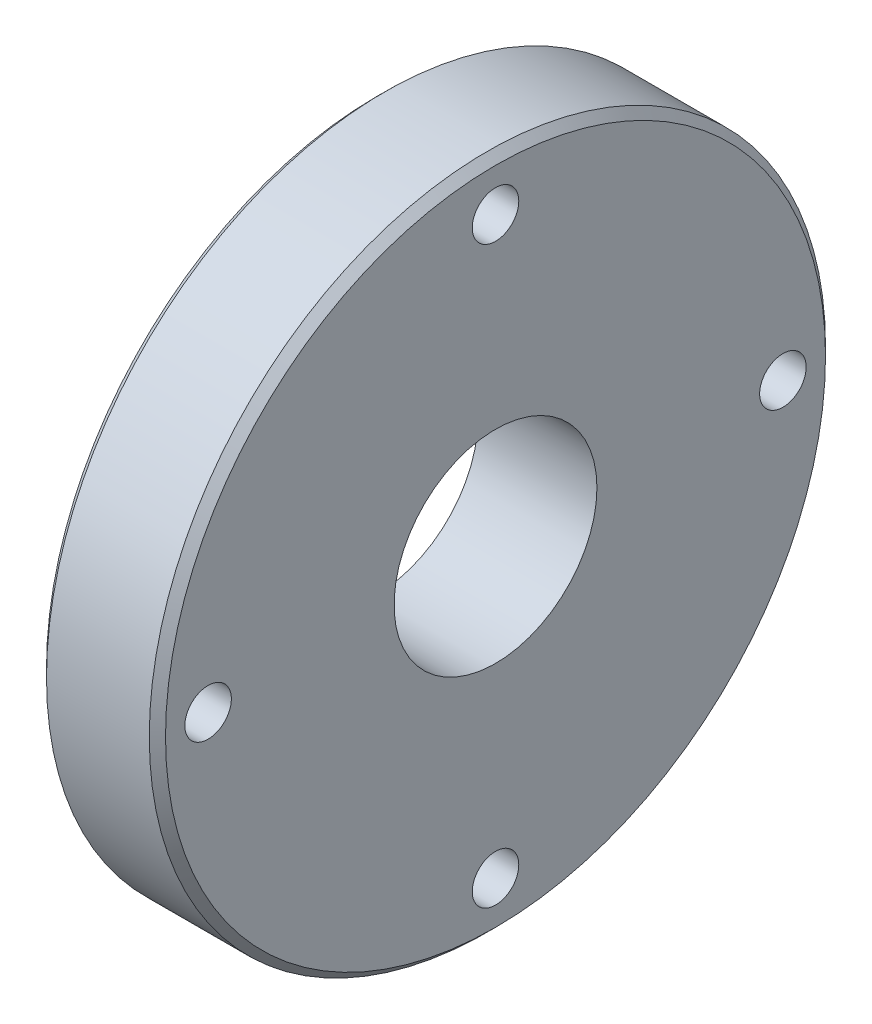
ISO-10303-21;
HEADER;
FILE_DESCRIPTION(('STEP AP214'),'2;1');
FILE_NAME('part.step','',(''),(''),'','','');
FILE_SCHEMA(('AUTOMOTIVE_DESIGN { 1 0 10303 214 1 1 1 1 }'));
ENDSEC;
DATA;
#1=APPLICATION_CONTEXT('core data for automotive mechanical design processes');
#2=APPLICATION_PROTOCOL_DEFINITION('international standard','automotive_design',2000,#1);
#3=PRODUCT_CONTEXT('',#1,'mechanical');
#4=PRODUCT('Part','Part','',(#3));
#5=PRODUCT_RELATED_PRODUCT_CATEGORY('part','',(#4));
#6=PRODUCT_DEFINITION_FORMATION('','',#4);
#7=PRODUCT_DEFINITION_CONTEXT('part definition',#1,'design');
#8=PRODUCT_DEFINITION('design','',#6,#7);
#9=PRODUCT_DEFINITION_SHAPE('','',#8);
#10=(LENGTH_UNIT() NAMED_UNIT(*) SI_UNIT(.MILLI.,.METRE.));
#11=(NAMED_UNIT(*) PLANE_ANGLE_UNIT() SI_UNIT($,.RADIAN.));
#12=(NAMED_UNIT(*) SI_UNIT($,.STERADIAN.) SOLID_ANGLE_UNIT());
#13=UNCERTAINTY_MEASURE_WITH_UNIT(LENGTH_MEASURE(1.E-05),#10,'distance_accuracy_value','');
#14=(GEOMETRIC_REPRESENTATION_CONTEXT(3) GLOBAL_UNCERTAINTY_ASSIGNED_CONTEXT((#13)) GLOBAL_UNIT_ASSIGNED_CONTEXT((#10,
#11,#12)) REPRESENTATION_CONTEXT('',''));
#15=CARTESIAN_POINT('',(0.,0.,0.));
#16=DIRECTION('',(0.,0.,1.));
#17=DIRECTION('',(1.,0.,0.));
#18=AXIS2_PLACEMENT_3D('',#15,#16,#17);
#19=CARTESIAN_POINT('',(22.352,0.,0.));
#20=DIRECTION('',(-1.,0.,0.));
#21=DIRECTION('',(0.,0.,1.));
#22=AXIS2_PLACEMENT_3D('',#19,#20,#21);
#23=CYLINDRICAL_SURFACE('',#22,63.5);
#24=CARTESIAN_POINT('',(20.828,0.,0.));
#25=DIRECTION('',(1.,0.,0.));
#26=DIRECTION('',(0.,0.,-1.));
#27=AXIS2_PLACEMENT_3D('',#24,#25,#26);
#28=CIRCLE('',#27,63.5);
#29=CARTESIAN_POINT('',(20.828,0.,63.5));
#30=VERTEX_POINT('',#29);
#31=EDGE_CURVE('E47',#30,#30,#28,.F.);
#32=ORIENTED_EDGE('',*,*,#31,.T.);
#33=EDGE_LOOP('',(#32));
#34=FACE_BOUND('',#33,.T.);
#35=CARTESIAN_POINT('',(1.52399999999998,0.,0.));
#36=DIRECTION('',(1.,0.,0.));
#37=DIRECTION('',(0.,0.,-1.));
#38=AXIS2_PLACEMENT_3D('',#35,#36,#37);
#39=CIRCLE('',#38,63.5);
#40=CARTESIAN_POINT('',(1.52399999999998,0.,-63.5));
#41=VERTEX_POINT('',#40);
#42=EDGE_CURVE('E51',#41,#41,#39,.T.);
#43=ORIENTED_EDGE('',*,*,#42,.T.);
#44=EDGE_LOOP('',(#43));
#45=FACE_BOUND('',#44,.T.);
#46=ADVANCED_FACE('F39',(#34,#45),#23,.T.);
#47=CARTESIAN_POINT('',(22.352,0.,0.));
#48=DIRECTION('',(1.,0.,0.));
#49=DIRECTION('',(0.,0.,-1.));
#50=AXIS2_PLACEMENT_3D('',#47,#48,#49);
#51=PLANE('',#50);
#52=CARTESIAN_POINT('',(22.352,0.,0.));
#53=DIRECTION('',(1.,0.,0.));
#54=DIRECTION('',(0.,0.,-1.));
#55=AXIS2_PLACEMENT_3D('',#52,#53,#54);
#56=CIRCLE('',#55,61.976);
#57=CARTESIAN_POINT('',(22.352,0.,61.976));
#58=VERTEX_POINT('',#57);
#59=EDGE_CURVE('E55',#58,#58,#56,.T.);
#60=ORIENTED_EDGE('',*,*,#59,.T.);
#61=EDGE_LOOP('',(#60));
#62=FACE_BOUND('',#61,.T.);
#63=CARTESIAN_POINT('',(22.352,53.975,0.));
#64=DIRECTION('',(1.,0.,0.));
#65=DIRECTION('',(0.,0.,-1.));
#66=AXIS2_PLACEMENT_3D('',#63,#64,#65);
#67=CIRCLE('',#66,4.3688);
#68=CARTESIAN_POINT('',(22.352,53.975,-4.3688));
#69=VERTEX_POINT('',#68);
#70=EDGE_CURVE('E78',#69,#69,#67,.T.);
#71=ORIENTED_EDGE('',*,*,#70,.F.);
#72=EDGE_LOOP('',(#71));
#73=FACE_BOUND('',#72,.T.);
#74=CARTESIAN_POINT('',(22.352,0.,53.975));
#75=DIRECTION('',(1.,0.,0.));
#76=DIRECTION('',(0.,0.,-1.));
#77=AXIS2_PLACEMENT_3D('',#74,#75,#76);
#78=CIRCLE('',#77,4.3688);
#79=CARTESIAN_POINT('',(22.352,0.,49.6062));
#80=VERTEX_POINT('',#79);
#81=EDGE_CURVE('E86',#80,#80,#78,.T.);
#82=ORIENTED_EDGE('',*,*,#81,.F.);
#83=EDGE_LOOP('',(#82));
#84=FACE_BOUND('',#83,.T.);
#85=CARTESIAN_POINT('',(22.352,-53.975,0.));
#86=DIRECTION('',(1.,0.,0.));
#87=DIRECTION('',(0.,0.,-1.));
#88=AXIS2_PLACEMENT_3D('',#85,#86,#87);
#89=CIRCLE('',#88,4.3688);
#90=CARTESIAN_POINT('',(22.352,-53.975,-4.3688));
#91=VERTEX_POINT('',#90);
#92=EDGE_CURVE('E83',#91,#91,#89,.T.);
#93=ORIENTED_EDGE('',*,*,#92,.F.);
#94=EDGE_LOOP('',(#93));
#95=FACE_BOUND('',#94,.T.);
#96=CARTESIAN_POINT('',(22.352,0.,-53.975));
#97=DIRECTION('',(1.,0.,0.));
#98=DIRECTION('',(0.,0.,-1.));
#99=AXIS2_PLACEMENT_3D('',#96,#97,#98);
#100=CIRCLE('',#99,4.36879999999999);
#101=CARTESIAN_POINT('',(22.352,0.,-58.3438));
#102=VERTEX_POINT('',#101);
#103=EDGE_CURVE('E64',#102,#102,#100,.T.);
#104=ORIENTED_EDGE('',*,*,#103,.F.);
#105=EDGE_LOOP('',(#104));
#106=FACE_BOUND('',#105,.T.);
#107=CARTESIAN_POINT('',(22.352,0.,0.));
#108=DIRECTION('',(1.,0.,0.));
#109=DIRECTION('',(0.,0.,-1.));
#110=AXIS2_PLACEMENT_3D('',#107,#108,#109);
#111=CIRCLE('',#110,19.05);
#112=CARTESIAN_POINT('',(22.352,0.,-19.05));
#113=VERTEX_POINT('',#112);
#114=EDGE_CURVE('E60',#113,#113,#111,.T.);
#115=ORIENTED_EDGE('',*,*,#114,.F.);
#116=EDGE_LOOP('',(#115));
#117=FACE_BOUND('',#116,.T.);
#118=ADVANCED_FACE('F133',(#62,#73,#84,#95,#106,#117),#51,.T.);
#119=CARTESIAN_POINT('',(0.,0.,0.));
#120=DIRECTION('',(1.,0.,0.));
#121=DIRECTION('',(0.,0.,-1.));
#122=AXIS2_PLACEMENT_3D('',#119,#120,#121);
#123=PLANE('',#122);
#124=CARTESIAN_POINT('',(0.,0.,0.));
#125=DIRECTION('',(1.,0.,0.));
#126=DIRECTION('',(0.,0.,-1.));
#127=AXIS2_PLACEMENT_3D('',#124,#125,#126);
#128=CIRCLE('',#127,61.976);
#129=CARTESIAN_POINT('',(0.,0.,-61.976));
#130=VERTEX_POINT('',#129);
#131=EDGE_CURVE('E10',#130,#130,#128,.F.);
#132=ORIENTED_EDGE('',*,*,#131,.T.);
#133=EDGE_LOOP('',(#132));
#134=FACE_BOUND('',#133,.T.);
#135=CARTESIAN_POINT('',(0.,53.975,0.));
#136=DIRECTION('',(1.,0.,0.));
#137=DIRECTION('',(0.,0.,-1.));
#138=AXIS2_PLACEMENT_3D('',#135,#136,#137);
#139=CIRCLE('',#138,6.7437);
#140=CARTESIAN_POINT('',(0.,53.975,-6.7437));
#141=VERTEX_POINT('',#140);
#142=EDGE_CURVE('E109',#141,#141,#139,.T.);
#143=ORIENTED_EDGE('',*,*,#142,.T.);
#144=EDGE_LOOP('',(#143));
#145=FACE_BOUND('',#144,.T.);
#146=CARTESIAN_POINT('',(0.,0.,53.975));
#147=DIRECTION('',(1.,0.,0.));
#148=DIRECTION('',(0.,0.,-1.));
#149=AXIS2_PLACEMENT_3D('',#146,#147,#148);
#150=CIRCLE('',#149,6.7437);
#151=CARTESIAN_POINT('',(0.,0.,47.2313));
#152=VERTEX_POINT('',#151);
#153=EDGE_CURVE('E106',#152,#152,#150,.T.);
#154=ORIENTED_EDGE('',*,*,#153,.T.);
#155=EDGE_LOOP('',(#154));
#156=FACE_BOUND('',#155,.T.);
#157=CARTESIAN_POINT('',(0.,-53.975,0.));
#158=DIRECTION('',(1.,0.,0.));
#159=DIRECTION('',(0.,0.,-1.));
#160=AXIS2_PLACEMENT_3D('',#157,#158,#159);
#161=CIRCLE('',#160,6.7437);
#162=CARTESIAN_POINT('',(0.,-53.975,-6.7437));
#163=VERTEX_POINT('',#162);
#164=EDGE_CURVE('E100',#163,#163,#161,.T.);
#165=ORIENTED_EDGE('',*,*,#164,.T.);
#166=EDGE_LOOP('',(#165));
#167=FACE_BOUND('',#166,.T.);
#168=CARTESIAN_POINT('',(0.,0.,-53.975));
#169=DIRECTION('',(1.,0.,0.));
#170=DIRECTION('',(0.,0.,-1.));
#171=AXIS2_PLACEMENT_3D('',#168,#169,#170);
#172=CIRCLE('',#171,6.74369999999999);
#173=CARTESIAN_POINT('',(0.,0.,-60.7187));
#174=VERTEX_POINT('',#173);
#175=EDGE_CURVE('E94',#174,#174,#172,.T.);
#176=ORIENTED_EDGE('',*,*,#175,.T.);
#177=EDGE_LOOP('',(#176));
#178=FACE_BOUND('',#177,.T.);
#179=CARTESIAN_POINT('',(0.,0.,0.));
#180=DIRECTION('',(1.,0.,0.));
#181=DIRECTION('',(0.,0.,-1.));
#182=AXIS2_PLACEMENT_3D('',#179,#180,#181);
#183=CIRCLE('',#182,19.05);
#184=CARTESIAN_POINT('',(0.,0.,-19.05));
#185=VERTEX_POINT('',#184);
#186=EDGE_CURVE('E75',#185,#185,#183,.T.);
#187=ORIENTED_EDGE('',*,*,#186,.T.);
#188=EDGE_LOOP('',(#187));
#189=FACE_BOUND('',#188,.T.);
#190=ADVANCED_FACE('F139',(#134,#145,#156,#167,#178,#189),#123,.F.);
#191=CARTESIAN_POINT('',(22.352,0.,0.));
#192=DIRECTION('',(-1.,0.,0.));
#193=DIRECTION('',(0.,0.,1.));
#194=AXIS2_PLACEMENT_3D('',#191,#192,#193);
#195=CYLINDRICAL_SURFACE('',#194,19.05);
#196=ORIENTED_EDGE('',*,*,#114,.T.);
#197=EDGE_LOOP('',(#196));
#198=FACE_BOUND('',#197,.T.);
#199=ORIENTED_EDGE('',*,*,#186,.F.);
#200=EDGE_LOOP('',(#199));
#201=FACE_BOUND('',#200,.T.);
#202=ADVANCED_FACE('F172',(#198,#201),#195,.F.);
#203=CARTESIAN_POINT('',(22.352,0.,-53.975));
#204=DIRECTION('',(-1.,0.,0.));
#205=DIRECTION('',(0.,0.,1.));
#206=AXIS2_PLACEMENT_3D('',#203,#204,#205);
#207=CYLINDRICAL_SURFACE('',#206,4.36879999999999);
#208=CARTESIAN_POINT('',(9.652,0.,-53.975));
#209=DIRECTION('',(1.,0.,0.));
#210=DIRECTION('',(0.,0.,-1.));
#211=AXIS2_PLACEMENT_3D('',#208,#209,#210);
#212=CIRCLE('',#211,4.36879999999999);
#213=CARTESIAN_POINT('',(9.652,0.,-58.3438));
#214=VERTEX_POINT('',#213);
#215=EDGE_CURVE('E61',#214,#214,#212,.T.);
#216=ORIENTED_EDGE('',*,*,#215,.F.);
#217=EDGE_LOOP('',(#216));
#218=FACE_BOUND('',#217,.T.);
#219=ORIENTED_EDGE('',*,*,#103,.T.);
#220=EDGE_LOOP('',(#219));
#221=FACE_BOUND('',#220,.T.);
#222=ADVANCED_FACE('F175',(#218,#221),#207,.F.);
#223=CARTESIAN_POINT('',(22.352,-53.975,0.));
#224=DIRECTION('',(-1.,0.,0.));
#225=DIRECTION('',(0.,0.,1.));
#226=AXIS2_PLACEMENT_3D('',#223,#224,#225);
#227=CYLINDRICAL_SURFACE('',#226,4.3688);
#228=CARTESIAN_POINT('',(9.652,-53.975,0.));
#229=DIRECTION('',(1.,0.,0.));
#230=DIRECTION('',(0.,0.,-1.));
#231=AXIS2_PLACEMENT_3D('',#228,#229,#230);
#232=CIRCLE('',#231,4.3688);
#233=CARTESIAN_POINT('',(9.652,-53.975,-4.3688));
#234=VERTEX_POINT('',#233);
#235=EDGE_CURVE('E65',#234,#234,#232,.T.);
#236=ORIENTED_EDGE('',*,*,#235,.F.);
#237=EDGE_LOOP('',(#236));
#238=FACE_BOUND('',#237,.T.);
#239=ORIENTED_EDGE('',*,*,#92,.T.);
#240=EDGE_LOOP('',(#239));
#241=FACE_BOUND('',#240,.T.);
#242=ADVANCED_FACE('F208',(#238,#241),#227,.F.);
#243=CARTESIAN_POINT('',(22.352,0.,53.975));
#244=DIRECTION('',(-1.,0.,0.));
#245=DIRECTION('',(0.,0.,1.));
#246=AXIS2_PLACEMENT_3D('',#243,#244,#245);
#247=CYLINDRICAL_SURFACE('',#246,4.3688);
#248=CARTESIAN_POINT('',(9.652,0.,53.975));
#249=DIRECTION('',(1.,0.,0.));
#250=DIRECTION('',(0.,0.,-1.));
#251=AXIS2_PLACEMENT_3D('',#248,#249,#250);
#252=CIRCLE('',#251,4.3688);
#253=CARTESIAN_POINT('',(9.652,0.,49.6062));
#254=VERTEX_POINT('',#253);
#255=EDGE_CURVE('E68',#254,#254,#252,.T.);
#256=ORIENTED_EDGE('',*,*,#255,.F.);
#257=EDGE_LOOP('',(#256));
#258=FACE_BOUND('',#257,.T.);
#259=ORIENTED_EDGE('',*,*,#81,.T.);
#260=EDGE_LOOP('',(#259));
#261=FACE_BOUND('',#260,.T.);
#262=ADVANCED_FACE('F204',(#258,#261),#247,.F.);
#263=CARTESIAN_POINT('',(22.352,53.975,0.));
#264=DIRECTION('',(-1.,0.,0.));
#265=DIRECTION('',(0.,0.,1.));
#266=AXIS2_PLACEMENT_3D('',#263,#264,#265);
#267=CYLINDRICAL_SURFACE('',#266,4.3688);
#268=CARTESIAN_POINT('',(9.652,53.975,0.));
#269=DIRECTION('',(1.,0.,0.));
#270=DIRECTION('',(0.,0.,-1.));
#271=AXIS2_PLACEMENT_3D('',#268,#269,#270);
#272=CIRCLE('',#271,4.3688);
#273=CARTESIAN_POINT('',(9.652,53.975,-4.3688));
#274=VERTEX_POINT('',#273);
#275=EDGE_CURVE('E71',#274,#274,#272,.T.);
#276=ORIENTED_EDGE('',*,*,#275,.F.);
#277=EDGE_LOOP('',(#276));
#278=FACE_BOUND('',#277,.T.);
#279=ORIENTED_EDGE('',*,*,#70,.T.);
#280=EDGE_LOOP('',(#279));
#281=FACE_BOUND('',#280,.T.);
#282=ADVANCED_FACE('F130',(#278,#281),#267,.F.);
#283=CARTESIAN_POINT('',(9.652,53.975,0.));
#284=DIRECTION('',(-1.,0.,0.));
#285=DIRECTION('',(0.,0.,1.));
#286=AXIS2_PLACEMENT_3D('',#283,#284,#285);
#287=CYLINDRICAL_SURFACE('',#286,6.7437);
#288=CARTESIAN_POINT('',(9.652,53.975,0.));
#289=DIRECTION('',(1.,0.,0.));
#290=DIRECTION('',(0.,0.,-1.));
#291=AXIS2_PLACEMENT_3D('',#288,#289,#290);
#292=CIRCLE('',#291,6.7437);
#293=CARTESIAN_POINT('',(9.652,53.975,-6.7437));
#294=VERTEX_POINT('',#293);
#295=EDGE_CURVE('E74',#294,#294,#292,.T.);
#296=ORIENTED_EDGE('',*,*,#295,.T.);
#297=EDGE_LOOP('',(#296));
#298=FACE_BOUND('',#297,.T.);
#299=ORIENTED_EDGE('',*,*,#142,.F.);
#300=EDGE_LOOP('',(#299));
#301=FACE_BOUND('',#300,.T.);
#302=ADVANCED_FACE('F115',(#298,#301),#287,.F.);
#303=CARTESIAN_POINT('',(9.652,53.975,0.));
#304=DIRECTION('',(1.,0.,0.));
#305=DIRECTION('',(0.,0.,-1.));
#306=AXIS2_PLACEMENT_3D('',#303,#304,#305);
#307=PLANE('',#306);
#308=ORIENTED_EDGE('',*,*,#275,.T.);
#309=EDGE_LOOP('',(#308));
#310=FACE_BOUND('',#309,.T.);
#311=ORIENTED_EDGE('',*,*,#295,.F.);
#312=EDGE_LOOP('',(#311));
#313=FACE_BOUND('',#312,.T.);
#314=ADVANCED_FACE('F118',(#310,#313),#307,.F.);
#315=CARTESIAN_POINT('',(9.652,0.,53.975));
#316=DIRECTION('',(-1.,0.,0.));
#317=DIRECTION('',(0.,0.,1.));
#318=AXIS2_PLACEMENT_3D('',#315,#316,#317);
#319=CYLINDRICAL_SURFACE('',#318,6.7437);
#320=CARTESIAN_POINT('',(9.652,0.,53.975));
#321=DIRECTION('',(1.,0.,0.));
#322=DIRECTION('',(0.,0.,-1.));
#323=AXIS2_PLACEMENT_3D('',#320,#321,#322);
#324=CIRCLE('',#323,6.7437);
#325=CARTESIAN_POINT('',(9.652,0.,47.2313));
#326=VERTEX_POINT('',#325);
#327=EDGE_CURVE('E103',#326,#326,#324,.T.);
#328=ORIENTED_EDGE('',*,*,#327,.T.);
#329=EDGE_LOOP('',(#328));
#330=FACE_BOUND('',#329,.T.);
#331=ORIENTED_EDGE('',*,*,#153,.F.);
#332=EDGE_LOOP('',(#331));
#333=FACE_BOUND('',#332,.T.);
#334=ADVANCED_FACE('F120',(#330,#333),#319,.F.);
#335=CARTESIAN_POINT('',(9.652,0.,53.975));
#336=DIRECTION('',(1.,0.,0.));
#337=DIRECTION('',(0.,0.,-1.));
#338=AXIS2_PLACEMENT_3D('',#335,#336,#337);
#339=PLANE('',#338);
#340=ORIENTED_EDGE('',*,*,#255,.T.);
#341=EDGE_LOOP('',(#340));
#342=FACE_BOUND('',#341,.T.);
#343=ORIENTED_EDGE('',*,*,#327,.F.);
#344=EDGE_LOOP('',(#343));
#345=FACE_BOUND('',#344,.T.);
#346=ADVANCED_FACE('F127',(#342,#345),#339,.F.);
#347=CARTESIAN_POINT('',(9.652,-53.975,0.));
#348=DIRECTION('',(-1.,0.,0.));
#349=DIRECTION('',(0.,0.,1.));
#350=AXIS2_PLACEMENT_3D('',#347,#348,#349);
#351=CYLINDRICAL_SURFACE('',#350,6.7437);
#352=CARTESIAN_POINT('',(9.652,-53.975,0.));
#353=DIRECTION('',(1.,0.,0.));
#354=DIRECTION('',(0.,0.,-1.));
#355=AXIS2_PLACEMENT_3D('',#352,#353,#354);
#356=CIRCLE('',#355,6.7437);
#357=CARTESIAN_POINT('',(9.652,-53.975,-6.7437));
#358=VERTEX_POINT('',#357);
#359=EDGE_CURVE('E97',#358,#358,#356,.T.);
#360=ORIENTED_EDGE('',*,*,#359,.T.);
#361=EDGE_LOOP('',(#360));
#362=FACE_BOUND('',#361,.T.);
#363=ORIENTED_EDGE('',*,*,#164,.F.);
#364=EDGE_LOOP('',(#363));
#365=FACE_BOUND('',#364,.T.);
#366=ADVANCED_FACE('F197',(#362,#365),#351,.F.);
#367=CARTESIAN_POINT('',(9.652,-53.975,0.));
#368=DIRECTION('',(1.,0.,0.));
#369=DIRECTION('',(0.,0.,-1.));
#370=AXIS2_PLACEMENT_3D('',#367,#368,#369);
#371=PLANE('',#370);
#372=ORIENTED_EDGE('',*,*,#235,.T.);
#373=EDGE_LOOP('',(#372));
#374=FACE_BOUND('',#373,.T.);
#375=ORIENTED_EDGE('',*,*,#359,.F.);
#376=EDGE_LOOP('',(#375));
#377=FACE_BOUND('',#376,.T.);
#378=ADVANCED_FACE('F191',(#374,#377),#371,.F.);
#379=CARTESIAN_POINT('',(9.652,0.,-53.975));
#380=DIRECTION('',(-1.,0.,0.));
#381=DIRECTION('',(0.,0.,1.));
#382=AXIS2_PLACEMENT_3D('',#379,#380,#381);
#383=CYLINDRICAL_SURFACE('',#382,6.74369999999999);
#384=CARTESIAN_POINT('',(9.652,0.,-53.975));
#385=DIRECTION('',(1.,0.,0.));
#386=DIRECTION('',(0.,0.,-1.));
#387=AXIS2_PLACEMENT_3D('',#384,#385,#386);
#388=CIRCLE('',#387,6.74369999999999);
#389=CARTESIAN_POINT('',(9.652,0.,-60.7187));
#390=VERTEX_POINT('',#389);
#391=EDGE_CURVE('E91',#390,#390,#388,.T.);
#392=ORIENTED_EDGE('',*,*,#391,.T.);
#393=EDGE_LOOP('',(#392));
#394=FACE_BOUND('',#393,.T.);
#395=ORIENTED_EDGE('',*,*,#175,.F.);
#396=EDGE_LOOP('',(#395));
#397=FACE_BOUND('',#396,.T.);
#398=ADVANCED_FACE('F156',(#394,#397),#383,.F.);
#399=CARTESIAN_POINT('',(9.652,0.,-53.975));
#400=DIRECTION('',(1.,0.,0.));
#401=DIRECTION('',(0.,0.,-1.));
#402=AXIS2_PLACEMENT_3D('',#399,#400,#401);
#403=PLANE('',#402);
#404=ORIENTED_EDGE('',*,*,#215,.T.);
#405=EDGE_LOOP('',(#404));
#406=FACE_BOUND('',#405,.T.);
#407=ORIENTED_EDGE('',*,*,#391,.F.);
#408=EDGE_LOOP('',(#407));
#409=FACE_BOUND('',#408,.T.);
#410=ADVANCED_FACE('F149',(#406,#409),#403,.F.);
#411=CARTESIAN_POINT('',(22.352,0.,0.));
#412=DIRECTION('',(-1.,0.,0.));
#413=DIRECTION('',(0.,0.,1.));
#414=AXIS2_PLACEMENT_3D('',#411,#412,#413);
#415=CONICAL_SURFACE('',#414,61.976,0.785398163397448);
#416=CARTESIAN_POINT('',(20.828,0.,63.5));
#417=CARTESIAN_POINT('',(20.843875,0.,63.484125));
#418=CARTESIAN_POINT('',(20.85975,0.,63.46825));
#419=CARTESIAN_POINT('',(20.8915,0.,63.4365));
#420=CARTESIAN_POINT('',(20.907375,0.,63.420625));
#421=CARTESIAN_POINT('',(20.939125,0.,63.388875));
#422=CARTESIAN_POINT('',(20.955,0.,63.373));
#423=CARTESIAN_POINT('',(20.98675,0.,63.34125));
#424=CARTESIAN_POINT('',(21.002625,0.,63.325375));
#425=CARTESIAN_POINT('',(21.034375,0.,63.293625));
#426=CARTESIAN_POINT('',(21.05025,0.,63.27775));
#427=CARTESIAN_POINT('',(21.082,0.,63.246));
#428=CARTESIAN_POINT('',(21.097875,0.,63.230125));
#429=CARTESIAN_POINT('',(21.129625,0.,63.198375));
#430=CARTESIAN_POINT('',(21.1455,0.,63.1825));
#431=CARTESIAN_POINT('',(21.17725,0.,63.15075));
#432=CARTESIAN_POINT('',(21.193125,0.,63.134875));
#433=CARTESIAN_POINT('',(21.224875,0.,63.103125));
#434=CARTESIAN_POINT('',(21.24075,0.,63.08725));
#435=CARTESIAN_POINT('',(21.2725,0.,63.0555));
#436=CARTESIAN_POINT('',(21.288375,0.,63.039625));
#437=CARTESIAN_POINT('',(21.320125,0.,63.007875));
#438=CARTESIAN_POINT('',(21.336,0.,62.992));
#439=CARTESIAN_POINT('',(21.36775,0.,62.96025));
#440=CARTESIAN_POINT('',(21.383625,0.,62.944375));
#441=CARTESIAN_POINT('',(21.415375,0.,62.912625));
#442=CARTESIAN_POINT('',(21.43125,0.,62.89675));
#443=CARTESIAN_POINT('',(21.463,0.,62.865));
#444=CARTESIAN_POINT('',(21.478875,0.,62.849125));
#445=CARTESIAN_POINT('',(21.510625,0.,62.817375));
#446=CARTESIAN_POINT('',(21.5265,0.,62.8015));
#447=CARTESIAN_POINT('',(21.55825,0.,62.76975));
#448=CARTESIAN_POINT('',(21.574125,0.,62.753875));
#449=CARTESIAN_POINT('',(21.605875,0.,62.722125));
#450=CARTESIAN_POINT('',(21.62175,0.,62.70625));
#451=CARTESIAN_POINT('',(21.6535,0.,62.6745));
#452=CARTESIAN_POINT('',(21.669375,0.,62.658625));
#453=CARTESIAN_POINT('',(21.701125,0.,62.626875));
#454=CARTESIAN_POINT('',(21.717,0.,62.611));
#455=CARTESIAN_POINT('',(21.74875,0.,62.57925));
#456=CARTESIAN_POINT('',(21.764625,0.,62.563375));
#457=CARTESIAN_POINT('',(21.796375,0.,62.531625));
#458=CARTESIAN_POINT('',(21.81225,0.,62.51575));
#459=CARTESIAN_POINT('',(21.844,0.,62.484));
#460=CARTESIAN_POINT('',(21.859875,0.,62.468125));
#461=CARTESIAN_POINT('',(21.891625,0.,62.436375));
#462=CARTESIAN_POINT('',(21.9075,0.,62.4205));
#463=CARTESIAN_POINT('',(21.93925,0.,62.38875));
#464=CARTESIAN_POINT('',(21.955125,0.,62.372875));
#465=CARTESIAN_POINT('',(21.986875,0.,62.341125));
#466=CARTESIAN_POINT('',(22.00275,0.,62.32525));
#467=CARTESIAN_POINT('',(22.0345,0.,62.2935));
#468=CARTESIAN_POINT('',(22.050375,0.,62.277625));
#469=CARTESIAN_POINT('',(22.082125,0.,62.245875));
#470=CARTESIAN_POINT('',(22.098,0.,62.23));
#471=CARTESIAN_POINT('',(22.12975,0.,62.19825));
#472=CARTESIAN_POINT('',(22.145625,0.,62.182375));
#473=CARTESIAN_POINT('',(22.177375,0.,62.150625));
#474=CARTESIAN_POINT('',(22.19325,0.,62.13475));
#475=CARTESIAN_POINT('',(22.225,0.,62.103));
#476=CARTESIAN_POINT('',(22.240875,0.,62.087125));
#477=CARTESIAN_POINT('',(22.272625,0.,62.055375));
#478=CARTESIAN_POINT('',(22.2885,0.,62.0395));
#479=CARTESIAN_POINT('',(22.32025,0.,62.00775));
#480=CARTESIAN_POINT('',(22.336125,0.,61.991875));
#481=CARTESIAN_POINT('',(22.352,0.,61.976));
#482=B_SPLINE_CURVE_WITH_KNOTS('',3,(#416,#417,#418,#419,#420,#421,#422,#423,#424,#425,#426,
#427,#428,#429,#430,#431,#432,#433,#434,#435,#436,#437,#438,#439,#440,#441,#442,#443,#444,#445,
#446,#447,#448,#449,#450,#451,#452,#453,#454,#455,#456,#457,#458,#459,#460,#461,#462,#463,#464,
#465,#466,#467,#468,#469,#470,#471,#472,#473,#474,#475,#476,#477,#478,#479,#480,#481),
.UNSPECIFIED.,.F.,.F.,(4,2,2,2,2,2,2,2,2,2,2,2,2,2,2,2,2,2,2,2,2,2,2,2,2,2,2,2,2,2,2,2,4),(0.,
0.0673519209080149,0.134703841816042,0.202055762724057,0.269407683632074,0.336759604540099,
0.404111525448116,0.471463446356131,0.538815367264158,0.606167288172173,0.6735192090802,
0.740871129988215,0.808223050896232,0.875574971804257,0.942926892712274,1.0102788136203,
1.07763073452832,1.14498265543633,1.21233457634436,1.27968649725237,1.34703841816039,
1.41439033906842,1.48174225997643,1.54909418088445,1.61644610179247,1.68379802270049,
1.75114994360851,1.81850186451653,1.88585378542455,1.95320570633257,2.02055762724059,
2.08790954814861,2.15526146905663),.UNSPECIFIED.);
#483=EDGE_CURVE('BSEAM145',#30,#58,#482,.T.);
#484=ORIENTED_EDGE('',*,*,#31,.F.);
#485=ORIENTED_EDGE('',*,*,#59,.F.);
#486=ORIENTED_EDGE('',*,*,#483,.T.);
#487=ORIENTED_EDGE('',*,*,#483,.F.);
#488=EDGE_LOOP('',(#484,#486,#485,#487));
#489=FACE_BOUND('',#488,.T.);
#490=ADVANCED_FACE('F145',(#489),#415,.T.);
#491=CARTESIAN_POINT('',(1.52399999999998,0.,0.));
#492=DIRECTION('',(1.,0.,0.));
#493=DIRECTION('',(0.,0.,-1.));
#494=AXIS2_PLACEMENT_3D('',#491,#492,#493);
#495=CONICAL_SURFACE('',#494,63.5,0.785398163397453);
#496=ORIENTED_EDGE('',*,*,#131,.F.);
#497=EDGE_LOOP('',(#496));
#498=FACE_BOUND('',#497,.T.);
#499=ORIENTED_EDGE('',*,*,#42,.F.);
#500=EDGE_LOOP('',(#499));
#501=FACE_BOUND('',#500,.T.);
#502=ADVANCED_FACE('F42',(#498,#501),#495,.T.);
#503=CLOSED_SHELL('',(#46,#118,#190,#202,#222,#242,#262,#282,#302,#314,#334,#346,#366,#378,#398,
#410,#490,#502));
#504=MANIFOLD_SOLID_BREP('B2',#503);
#505=ADVANCED_BREP_SHAPE_REPRESENTATION('',(#18,#504),#14);
#506=SHAPE_DEFINITION_REPRESENTATION(#9,#505);
ENDSEC;
END-ISO-10303-21;
